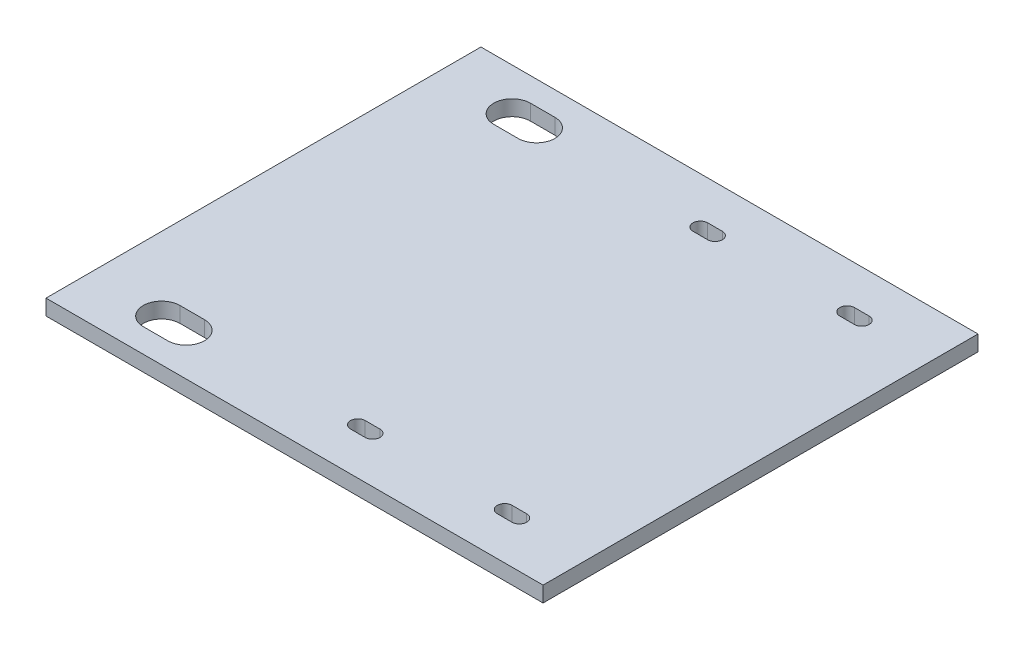
ISO-10303-21;
HEADER;
FILE_DESCRIPTION(('STEP AP214'),'2;1');
FILE_NAME('part.step','',(''),(''),'','','');
FILE_SCHEMA(('AUTOMOTIVE_DESIGN { 1 0 10303 214 1 1 1 1 }'));
ENDSEC;
DATA;
#1=APPLICATION_CONTEXT('core data for automotive mechanical design processes');
#2=APPLICATION_PROTOCOL_DEFINITION('international standard','automotive_design',2000,#1);
#3=PRODUCT_CONTEXT('',#1,'mechanical');
#4=PRODUCT('Part','Part','',(#3));
#5=PRODUCT_RELATED_PRODUCT_CATEGORY('part','',(#4));
#6=PRODUCT_DEFINITION_FORMATION('','',#4);
#7=PRODUCT_DEFINITION_CONTEXT('part definition',#1,'design');
#8=PRODUCT_DEFINITION('design','',#6,#7);
#9=PRODUCT_DEFINITION_SHAPE('','',#8);
#10=(LENGTH_UNIT() NAMED_UNIT(*) SI_UNIT(.MILLI.,.METRE.));
#11=(NAMED_UNIT(*) PLANE_ANGLE_UNIT() SI_UNIT($,.RADIAN.));
#12=(NAMED_UNIT(*) SI_UNIT($,.STERADIAN.) SOLID_ANGLE_UNIT());
#13=UNCERTAINTY_MEASURE_WITH_UNIT(LENGTH_MEASURE(1.E-05),#10,'distance_accuracy_value','');
#14=(GEOMETRIC_REPRESENTATION_CONTEXT(3) GLOBAL_UNCERTAINTY_ASSIGNED_CONTEXT((#13)) GLOBAL_UNIT_ASSIGNED_CONTEXT((#10,
#11,#12)) REPRESENTATION_CONTEXT('',''));
#15=CARTESIAN_POINT('',(0.,0.,0.));
#16=DIRECTION('',(0.,0.,1.));
#17=DIRECTION('',(1.,0.,0.));
#18=AXIS2_PLACEMENT_3D('',#15,#16,#17);
#19=CARTESIAN_POINT('',(-50.8,3.175,44.45));
#20=DIRECTION('',(1.,0.,0.));
#21=DIRECTION('',(0.,0.,-1.));
#22=AXIS2_PLACEMENT_3D('',#19,#20,#21);
#23=PLANE('',#22);
#24=DIRECTION('',(0.,0.,1.));
#25=VECTOR('',#24,1.);
#26=CARTESIAN_POINT('',(-50.8,0.,44.45));
#27=LINE('',#26,#25);
#28=CARTESIAN_POINT('',(-50.8,0.,-44.45));
#29=VERTEX_POINT('',#28);
#30=CARTESIAN_POINT('',(-50.8,0.,44.45));
#31=VERTEX_POINT('',#30);
#32=EDGE_CURVE('E484',#29,#31,#27,.T.);
#33=ORIENTED_EDGE('',*,*,#32,.T.);
#34=DIRECTION('',(0.,-1.,0.));
#35=VECTOR('',#34,1.);
#36=CARTESIAN_POINT('',(-50.8,3.175,44.45));
#37=LINE('',#36,#35);
#38=CARTESIAN_POINT('',(-50.8,3.175,44.45));
#39=VERTEX_POINT('',#38);
#40=EDGE_CURVE('E11',#39,#31,#37,.T.);
#41=ORIENTED_EDGE('',*,*,#40,.F.);
#42=DIRECTION('',(0.,0.,1.));
#43=VECTOR('',#42,1.);
#44=CARTESIAN_POINT('',(-50.8,3.175,44.45));
#45=LINE('',#44,#43);
#46=CARTESIAN_POINT('',(-50.8,3.175,-44.45));
#47=VERTEX_POINT('',#46);
#48=EDGE_CURVE('E494',#47,#39,#45,.T.);
#49=ORIENTED_EDGE('',*,*,#48,.F.);
#50=DIRECTION('',(0.,-1.,0.));
#51=VECTOR('',#50,1.);
#52=CARTESIAN_POINT('',(-50.8,3.175,-44.45));
#53=LINE('',#52,#51);
#54=EDGE_CURVE('E508',#47,#29,#53,.T.);
#55=ORIENTED_EDGE('',*,*,#54,.T.);
#56=EDGE_LOOP('',(#33,#41,#49,#55));
#57=FACE_BOUND('',#56,.T.);
#58=ADVANCED_FACE('F45',(#57),#23,.F.);
#59=CARTESIAN_POINT('',(50.8,3.175,44.45));
#60=DIRECTION('',(0.,0.,-1.));
#61=DIRECTION('',(-1.,0.,0.));
#62=AXIS2_PLACEMENT_3D('',#59,#60,#61);
#63=PLANE('',#62);
#64=DIRECTION('',(1.,0.,0.));
#65=VECTOR('',#64,1.);
#66=CARTESIAN_POINT('',(50.8,0.,44.45));
#67=LINE('',#66,#65);
#68=CARTESIAN_POINT('',(50.8,0.,44.45));
#69=VERTEX_POINT('',#68);
#70=EDGE_CURVE('E512',#31,#69,#67,.T.);
#71=ORIENTED_EDGE('',*,*,#70,.T.);
#72=DIRECTION('',(0.,-1.,0.));
#73=VECTOR('',#72,1.);
#74=CARTESIAN_POINT('',(50.8,3.175,44.45));
#75=LINE('',#74,#73);
#76=CARTESIAN_POINT('',(50.8,3.175,44.45));
#77=VERTEX_POINT('',#76);
#78=EDGE_CURVE('E53',#77,#69,#75,.T.);
#79=ORIENTED_EDGE('',*,*,#78,.F.);
#80=DIRECTION('',(1.,0.,0.));
#81=VECTOR('',#80,1.);
#82=CARTESIAN_POINT('',(50.8,3.175,44.45));
#83=LINE('',#82,#81);
#84=EDGE_CURVE('E498',#39,#77,#83,.T.);
#85=ORIENTED_EDGE('',*,*,#84,.F.);
#86=ORIENTED_EDGE('',*,*,#40,.T.);
#87=EDGE_LOOP('',(#71,#79,#85,#86));
#88=FACE_BOUND('',#87,.T.);
#89=ADVANCED_FACE('F547',(#88),#63,.F.);
#90=CARTESIAN_POINT('',(50.8,3.175,44.45));
#91=DIRECTION('',(-1.,0.,0.));
#92=DIRECTION('',(0.,0.,1.));
#93=AXIS2_PLACEMENT_3D('',#90,#91,#92);
#94=PLANE('',#93);
#95=DIRECTION('',(0.,0.,-1.));
#96=VECTOR('',#95,1.);
#97=CARTESIAN_POINT('',(50.8,0.,44.45));
#98=LINE('',#97,#96);
#99=CARTESIAN_POINT('',(50.8,0.,-44.45));
#100=VERTEX_POINT('',#99);
#101=EDGE_CURVE('E515',#69,#100,#98,.T.);
#102=ORIENTED_EDGE('',*,*,#101,.T.);
#103=DIRECTION('',(0.,-1.,0.));
#104=VECTOR('',#103,1.);
#105=CARTESIAN_POINT('',(50.8,3.175,-44.45));
#106=LINE('',#105,#104);
#107=CARTESIAN_POINT('',(50.8,3.175,-44.45));
#108=VERTEX_POINT('',#107);
#109=EDGE_CURVE('E523',#108,#100,#106,.T.);
#110=ORIENTED_EDGE('',*,*,#109,.F.);
#111=DIRECTION('',(0.,0.,-1.));
#112=VECTOR('',#111,1.);
#113=CARTESIAN_POINT('',(50.8,3.175,44.45));
#114=LINE('',#113,#112);
#115=EDGE_CURVE('E502',#77,#108,#114,.T.);
#116=ORIENTED_EDGE('',*,*,#115,.F.);
#117=ORIENTED_EDGE('',*,*,#78,.T.);
#118=EDGE_LOOP('',(#102,#110,#116,#117));
#119=FACE_BOUND('',#118,.T.);
#120=ADVANCED_FACE('F532',(#119),#94,.F.);
#121=CARTESIAN_POINT('',(50.8,3.175,-44.45));
#122=DIRECTION('',(0.,0.,1.));
#123=DIRECTION('',(1.,0.,0.));
#124=AXIS2_PLACEMENT_3D('',#121,#122,#123);
#125=PLANE('',#124);
#126=DIRECTION('',(-1.,0.,0.));
#127=VECTOR('',#126,1.);
#128=CARTESIAN_POINT('',(50.8,0.,-44.45));
#129=LINE('',#128,#127);
#130=EDGE_CURVE('E499',#100,#29,#129,.T.);
#131=ORIENTED_EDGE('',*,*,#130,.T.);
#132=ORIENTED_EDGE('',*,*,#54,.F.);
#133=DIRECTION('',(-1.,0.,0.));
#134=VECTOR('',#133,1.);
#135=CARTESIAN_POINT('',(50.8,3.175,-44.45));
#136=LINE('',#135,#134);
#137=EDGE_CURVE('E505',#108,#47,#136,.T.);
#138=ORIENTED_EDGE('',*,*,#137,.F.);
#139=ORIENTED_EDGE('',*,*,#109,.T.);
#140=EDGE_LOOP('',(#131,#132,#138,#139));
#141=FACE_BOUND('',#140,.T.);
#142=ADVANCED_FACE('F541',(#141),#125,.F.);
#143=CARTESIAN_POINT('',(0.,3.175,0.));
#144=DIRECTION('',(0.,1.,0.));
#145=DIRECTION('',(0.,0.,1.));
#146=AXIS2_PLACEMENT_3D('',#143,#144,#145);
#147=PLANE('',#146);
#148=CARTESIAN_POINT('',(3.5,3.175,35.));
#149=DIRECTION('',(0.,1.,0.));
#150=DIRECTION('',(0.,0.,1.));
#151=AXIS2_PLACEMENT_3D('',#148,#149,#150);
#152=CIRCLE('',#151,1.5);
#153=CARTESIAN_POINT('',(3.5,3.175,33.5));
#154=VERTEX_POINT('',#153);
#155=CARTESIAN_POINT('',(3.5,3.175,36.5));
#156=VERTEX_POINT('',#155);
#157=EDGE_CURVE('E60',#154,#156,#152,.T.);
#158=ORIENTED_EDGE('',*,*,#157,.F.);
#159=DIRECTION('',(-1.,0.,0.));
#160=VECTOR('',#159,1.);
#161=CARTESIAN_POINT('',(3.5,3.175,33.5));
#162=LINE('',#161,#160);
#163=CARTESIAN_POINT('',(6.5,3.175,33.5));
#164=VERTEX_POINT('',#163);
#165=EDGE_CURVE('E333',#164,#154,#162,.T.);
#166=ORIENTED_EDGE('',*,*,#165,.F.);
#167=CARTESIAN_POINT('',(6.5,3.175,35.));
#168=DIRECTION('',(0.,1.,0.));
#169=DIRECTION('',(0.,0.,1.));
#170=AXIS2_PLACEMENT_3D('',#167,#168,#169);
#171=CIRCLE('',#170,1.5);
#172=CARTESIAN_POINT('',(6.5,3.175,36.5));
#173=VERTEX_POINT('',#172);
#174=EDGE_CURVE('E337',#173,#164,#171,.T.);
#175=ORIENTED_EDGE('',*,*,#174,.F.);
#176=DIRECTION('',(1.,0.,0.));
#177=VECTOR('',#176,1.);
#178=CARTESIAN_POINT('',(3.5,3.175,36.5));
#179=LINE('',#178,#177);
#180=EDGE_CURVE('E342',#156,#173,#179,.T.);
#181=ORIENTED_EDGE('',*,*,#180,.F.);
#182=EDGE_LOOP('',(#158,#166,#175,#181));
#183=FACE_BOUND('',#182,.T.);
#184=CARTESIAN_POINT('',(33.5,3.175,-35.));
#185=DIRECTION('',(0.,1.,0.));
#186=DIRECTION('',(0.,0.,1.));
#187=AXIS2_PLACEMENT_3D('',#184,#185,#186);
#188=CIRCLE('',#187,1.49999999999999);
#189=CARTESIAN_POINT('',(33.5,3.175,-36.5));
#190=VERTEX_POINT('',#189);
#191=CARTESIAN_POINT('',(33.5,3.175,-33.5));
#192=VERTEX_POINT('',#191);
#193=EDGE_CURVE('E68',#190,#192,#188,.T.);
#194=ORIENTED_EDGE('',*,*,#193,.F.);
#195=DIRECTION('',(-1.,0.,0.));
#196=VECTOR('',#195,1.);
#197=CARTESIAN_POINT('',(33.5,3.175,-36.5));
#198=LINE('',#197,#196);
#199=CARTESIAN_POINT('',(36.5,3.175,-36.5));
#200=VERTEX_POINT('',#199);
#201=EDGE_CURVE('E294',#200,#190,#198,.T.);
#202=ORIENTED_EDGE('',*,*,#201,.F.);
#203=CARTESIAN_POINT('',(36.5,3.175,-35.));
#204=DIRECTION('',(0.,1.,0.));
#205=DIRECTION('',(0.,0.,1.));
#206=AXIS2_PLACEMENT_3D('',#203,#204,#205);
#207=CIRCLE('',#206,1.49999999999999);
#208=CARTESIAN_POINT('',(36.5,3.175,-33.5));
#209=VERTEX_POINT('',#208);
#210=EDGE_CURVE('E298',#209,#200,#207,.T.);
#211=ORIENTED_EDGE('',*,*,#210,.F.);
#212=DIRECTION('',(1.,0.,0.));
#213=VECTOR('',#212,1.);
#214=CARTESIAN_POINT('',(33.5,3.175,-33.5));
#215=LINE('',#214,#213);
#216=EDGE_CURVE('E303',#192,#209,#215,.T.);
#217=ORIENTED_EDGE('',*,*,#216,.F.);
#218=EDGE_LOOP('',(#194,#202,#211,#217));
#219=FACE_BOUND('',#218,.T.);
#220=CARTESIAN_POINT('',(3.49999999999999,3.175,-35.));
#221=DIRECTION('',(0.,1.,0.));
#222=DIRECTION('',(0.,0.,1.));
#223=AXIS2_PLACEMENT_3D('',#220,#221,#222);
#224=CIRCLE('',#223,1.49999999999999);
#225=CARTESIAN_POINT('',(3.49999999999999,3.175,-36.5));
#226=VERTEX_POINT('',#225);
#227=CARTESIAN_POINT('',(3.49999999999999,3.175,-33.5));
#228=VERTEX_POINT('',#227);
#229=EDGE_CURVE('E376',#226,#228,#224,.T.);
#230=ORIENTED_EDGE('',*,*,#229,.F.);
#231=DIRECTION('',(-1.,0.,0.));
#232=VECTOR('',#231,1.);
#233=CARTESIAN_POINT('',(3.49999999999999,3.175,-36.5));
#234=LINE('',#233,#232);
#235=CARTESIAN_POINT('',(6.49999999999998,3.175,-36.5));
#236=VERTEX_POINT('',#235);
#237=EDGE_CURVE('E421',#236,#226,#234,.T.);
#238=ORIENTED_EDGE('',*,*,#237,.F.);
#239=CARTESIAN_POINT('',(6.49999999999998,3.175,-35.));
#240=DIRECTION('',(0.,1.,0.));
#241=DIRECTION('',(0.,0.,1.));
#242=AXIS2_PLACEMENT_3D('',#239,#240,#241);
#243=CIRCLE('',#242,1.49999999999999);
#244=CARTESIAN_POINT('',(6.49999999999998,3.175,-33.5));
#245=VERTEX_POINT('',#244);
#246=EDGE_CURVE('E425',#245,#236,#243,.T.);
#247=ORIENTED_EDGE('',*,*,#246,.F.);
#248=DIRECTION('',(1.,0.,0.));
#249=VECTOR('',#248,1.);
#250=CARTESIAN_POINT('',(3.49999999999999,3.175,-33.5));
#251=LINE('',#250,#249);
#252=EDGE_CURVE('E430',#228,#245,#251,.T.);
#253=ORIENTED_EDGE('',*,*,#252,.F.);
#254=EDGE_LOOP('',(#230,#238,#247,#253));
#255=FACE_BOUND('',#254,.T.);
#256=CARTESIAN_POINT('',(-35.8,3.175,35.814));
#257=DIRECTION('',(0.,1.,0.));
#258=DIRECTION('',(0.,0.,1.));
#259=AXIS2_PLACEMENT_3D('',#256,#257,#258);
#260=CIRCLE('',#259,3.75);
#261=CARTESIAN_POINT('',(-35.8,3.175,32.064));
#262=VERTEX_POINT('',#261);
#263=CARTESIAN_POINT('',(-35.8,3.175,39.564));
#264=VERTEX_POINT('',#263);
#265=EDGE_CURVE('E390',#262,#264,#260,.T.);
#266=ORIENTED_EDGE('',*,*,#265,.F.);
#267=DIRECTION('',(-1.,0.,0.));
#268=VECTOR('',#267,1.);
#269=CARTESIAN_POINT('',(-35.8,3.175,32.064));
#270=LINE('',#269,#268);
#271=CARTESIAN_POINT('',(-30.8,3.175,32.064));
#272=VERTEX_POINT('',#271);
#273=EDGE_CURVE('E377',#272,#262,#270,.T.);
#274=ORIENTED_EDGE('',*,*,#273,.F.);
#275=CARTESIAN_POINT('',(-30.8,3.175,35.814));
#276=DIRECTION('',(0.,1.,0.));
#277=DIRECTION('',(0.,0.,1.));
#278=AXIS2_PLACEMENT_3D('',#275,#276,#277);
#279=CIRCLE('',#278,3.75);
#280=CARTESIAN_POINT('',(-30.8,3.175,39.564));
#281=VERTEX_POINT('',#280);
#282=EDGE_CURVE('E381',#281,#272,#279,.T.);
#283=ORIENTED_EDGE('',*,*,#282,.F.);
#284=DIRECTION('',(1.,0.,0.));
#285=VECTOR('',#284,1.);
#286=CARTESIAN_POINT('',(-35.8,3.175,39.564));
#287=LINE('',#286,#285);
#288=EDGE_CURVE('E386',#264,#281,#287,.T.);
#289=ORIENTED_EDGE('',*,*,#288,.F.);
#290=EDGE_LOOP('',(#266,#274,#283,#289));
#291=FACE_BOUND('',#290,.T.);
#292=CARTESIAN_POINT('',(33.5,3.175,35.));
#293=DIRECTION('',(0.,1.,0.));
#294=DIRECTION('',(0.,0.,1.));
#295=AXIS2_PLACEMENT_3D('',#292,#293,#294);
#296=CIRCLE('',#295,1.5);
#297=CARTESIAN_POINT('',(33.5,3.175,33.5));
#298=VERTEX_POINT('',#297);
#299=CARTESIAN_POINT('',(33.5,3.175,36.5));
#300=VERTEX_POINT('',#299);
#301=EDGE_CURVE('E233',#298,#300,#296,.T.);
#302=ORIENTED_EDGE('',*,*,#301,.F.);
#303=DIRECTION('',(-1.,0.,0.));
#304=VECTOR('',#303,1.);
#305=CARTESIAN_POINT('',(33.5,3.175,33.5));
#306=LINE('',#305,#304);
#307=CARTESIAN_POINT('',(36.5,3.175,33.5));
#308=VERTEX_POINT('',#307);
#309=EDGE_CURVE('E244',#308,#298,#306,.T.);
#310=ORIENTED_EDGE('',*,*,#309,.F.);
#311=CARTESIAN_POINT('',(36.5,3.175,35.));
#312=DIRECTION('',(0.,1.,0.));
#313=DIRECTION('',(0.,0.,1.));
#314=AXIS2_PLACEMENT_3D('',#311,#312,#313);
#315=CIRCLE('',#314,1.5);
#316=CARTESIAN_POINT('',(36.5,3.175,36.5));
#317=VERTEX_POINT('',#316);
#318=EDGE_CURVE('E250',#317,#308,#315,.T.);
#319=ORIENTED_EDGE('',*,*,#318,.F.);
#320=DIRECTION('',(1.,0.,0.));
#321=VECTOR('',#320,1.);
#322=CARTESIAN_POINT('',(33.5,3.175,36.5));
#323=LINE('',#322,#321);
#324=EDGE_CURVE('E256',#300,#317,#323,.T.);
#325=ORIENTED_EDGE('',*,*,#324,.F.);
#326=EDGE_LOOP('',(#302,#310,#319,#325));
#327=FACE_BOUND('',#326,.T.);
#328=CARTESIAN_POINT('',(-35.8,3.175,-35.814));
#329=DIRECTION('',(0.,1.,0.));
#330=DIRECTION('',(0.,0.,1.));
#331=AXIS2_PLACEMENT_3D('',#328,#329,#330);
#332=CIRCLE('',#331,3.75);
#333=CARTESIAN_POINT('',(-35.8,3.175,-39.564));
#334=VERTEX_POINT('',#333);
#335=CARTESIAN_POINT('',(-35.8,3.175,-32.064));
#336=VERTEX_POINT('',#335);
#337=EDGE_CURVE('E393',#334,#336,#332,.T.);
#338=ORIENTED_EDGE('',*,*,#337,.F.);
#339=DIRECTION('',(-1.,0.,0.));
#340=VECTOR('',#339,1.);
#341=CARTESIAN_POINT('',(-35.8,3.175,-39.564));
#342=LINE('',#341,#340);
#343=CARTESIAN_POINT('',(-30.8,3.175,-39.564));
#344=VERTEX_POINT('',#343);
#345=EDGE_CURVE('E455',#344,#334,#342,.T.);
#346=ORIENTED_EDGE('',*,*,#345,.F.);
#347=CARTESIAN_POINT('',(-30.8,3.175,-35.814));
#348=DIRECTION('',(0.,1.,0.));
#349=DIRECTION('',(0.,0.,1.));
#350=AXIS2_PLACEMENT_3D('',#347,#348,#349);
#351=CIRCLE('',#350,3.75);
#352=CARTESIAN_POINT('',(-30.8,3.175,-32.064));
#353=VERTEX_POINT('',#352);
#354=EDGE_CURVE('E474',#353,#344,#351,.T.);
#355=ORIENTED_EDGE('',*,*,#354,.F.);
#356=DIRECTION('',(1.,0.,0.));
#357=VECTOR('',#356,1.);
#358=CARTESIAN_POINT('',(-35.8,3.175,-32.064));
#359=LINE('',#358,#357);
#360=EDGE_CURVE('E470',#336,#353,#359,.T.);
#361=ORIENTED_EDGE('',*,*,#360,.F.);
#362=EDGE_LOOP('',(#338,#346,#355,#361));
#363=FACE_BOUND('',#362,.T.);
#364=ORIENTED_EDGE('',*,*,#48,.T.);
#365=ORIENTED_EDGE('',*,*,#84,.T.);
#366=ORIENTED_EDGE('',*,*,#115,.T.);
#367=ORIENTED_EDGE('',*,*,#137,.T.);
#368=EDGE_LOOP('',(#364,#365,#366,#367));
#369=FACE_BOUND('',#368,.T.);
#370=ADVANCED_FACE('F253',(#183,#219,#255,#291,#327,#363,#369),#147,.T.);
#371=CARTESIAN_POINT('',(0.,0.,0.));
#372=DIRECTION('',(0.,1.,0.));
#373=DIRECTION('',(0.,0.,1.));
#374=AXIS2_PLACEMENT_3D('',#371,#372,#373);
#375=PLANE('',#374);
#376=DIRECTION('',(-1.,0.,0.));
#377=VECTOR('',#376,1.);
#378=CARTESIAN_POINT('',(3.5,0.,33.5));
#379=LINE('',#378,#377);
#380=CARTESIAN_POINT('',(6.5,0.,33.5));
#381=VERTEX_POINT('',#380);
#382=CARTESIAN_POINT('',(3.5,0.,33.5));
#383=VERTEX_POINT('',#382);
#384=EDGE_CURVE('E327',#381,#383,#379,.T.);
#385=ORIENTED_EDGE('',*,*,#384,.T.);
#386=CARTESIAN_POINT('',(3.5,0.,35.));
#387=DIRECTION('',(0.,1.,0.));
#388=DIRECTION('',(0.,0.,1.));
#389=AXIS2_PLACEMENT_3D('',#386,#387,#388);
#390=CIRCLE('',#389,1.5);
#391=CARTESIAN_POINT('',(3.5,0.,36.5));
#392=VERTEX_POINT('',#391);
#393=EDGE_CURVE('E338',#383,#392,#390,.T.);
#394=ORIENTED_EDGE('',*,*,#393,.T.);
#395=DIRECTION('',(1.,0.,0.));
#396=VECTOR('',#395,1.);
#397=CARTESIAN_POINT('',(3.5,0.,36.5));
#398=LINE('',#397,#396);
#399=CARTESIAN_POINT('',(6.5,0.,36.5));
#400=VERTEX_POINT('',#399);
#401=EDGE_CURVE('E355',#392,#400,#398,.T.);
#402=ORIENTED_EDGE('',*,*,#401,.T.);
#403=CARTESIAN_POINT('',(6.5,0.,35.));
#404=DIRECTION('',(0.,1.,0.));
#405=DIRECTION('',(0.,0.,1.));
#406=AXIS2_PLACEMENT_3D('',#403,#404,#405);
#407=CIRCLE('',#406,1.5);
#408=EDGE_CURVE('E351',#400,#381,#407,.T.);
#409=ORIENTED_EDGE('',*,*,#408,.T.);
#410=EDGE_LOOP('',(#385,#394,#402,#409));
#411=FACE_BOUND('',#410,.T.);
#412=DIRECTION('',(-1.,0.,0.));
#413=VECTOR('',#412,1.);
#414=CARTESIAN_POINT('',(33.5,0.,-36.5));
#415=LINE('',#414,#413);
#416=CARTESIAN_POINT('',(36.5,0.,-36.5));
#417=VERTEX_POINT('',#416);
#418=CARTESIAN_POINT('',(33.5,0.,-36.5));
#419=VERTEX_POINT('',#418);
#420=EDGE_CURVE('E284',#417,#419,#415,.T.);
#421=ORIENTED_EDGE('',*,*,#420,.T.);
#422=CARTESIAN_POINT('',(33.5,0.,-35.));
#423=DIRECTION('',(0.,1.,0.));
#424=DIRECTION('',(0.,0.,1.));
#425=AXIS2_PLACEMENT_3D('',#422,#423,#424);
#426=CIRCLE('',#425,1.49999999999999);
#427=CARTESIAN_POINT('',(33.5,0.,-33.5));
#428=VERTEX_POINT('',#427);
#429=EDGE_CURVE('E299',#419,#428,#426,.T.);
#430=ORIENTED_EDGE('',*,*,#429,.T.);
#431=DIRECTION('',(1.,0.,0.));
#432=VECTOR('',#431,1.);
#433=CARTESIAN_POINT('',(33.5,0.,-33.5));
#434=LINE('',#433,#432);
#435=CARTESIAN_POINT('',(36.5,0.,-33.5));
#436=VERTEX_POINT('',#435);
#437=EDGE_CURVE('E317',#428,#436,#434,.T.);
#438=ORIENTED_EDGE('',*,*,#437,.T.);
#439=CARTESIAN_POINT('',(36.5,0.,-35.));
#440=DIRECTION('',(0.,1.,0.));
#441=DIRECTION('',(0.,0.,1.));
#442=AXIS2_PLACEMENT_3D('',#439,#440,#441);
#443=CIRCLE('',#442,1.49999999999999);
#444=EDGE_CURVE('E313',#436,#417,#443,.T.);
#445=ORIENTED_EDGE('',*,*,#444,.T.);
#446=EDGE_LOOP('',(#421,#430,#438,#445));
#447=FACE_BOUND('',#446,.T.);
#448=DIRECTION('',(-1.,0.,0.));
#449=VECTOR('',#448,1.);
#450=CARTESIAN_POINT('',(3.49999999999999,0.,-36.5));
#451=LINE('',#450,#449);
#452=CARTESIAN_POINT('',(6.49999999999998,0.,-36.5));
#453=VERTEX_POINT('',#452);
#454=CARTESIAN_POINT('',(3.49999999999999,0.,-36.5));
#455=VERTEX_POINT('',#454);
#456=EDGE_CURVE('E412',#453,#455,#451,.T.);
#457=ORIENTED_EDGE('',*,*,#456,.T.);
#458=CARTESIAN_POINT('',(3.49999999999999,0.,-35.));
#459=DIRECTION('',(0.,1.,0.));
#460=DIRECTION('',(0.,0.,1.));
#461=AXIS2_PLACEMENT_3D('',#458,#459,#460);
#462=CIRCLE('',#461,1.49999999999999);
#463=CARTESIAN_POINT('',(3.49999999999999,0.,-33.5));
#464=VERTEX_POINT('',#463);
#465=EDGE_CURVE('E426',#455,#464,#462,.T.);
#466=ORIENTED_EDGE('',*,*,#465,.T.);
#467=DIRECTION('',(1.,0.,0.));
#468=VECTOR('',#467,1.);
#469=CARTESIAN_POINT('',(3.49999999999999,0.,-33.5));
#470=LINE('',#469,#468);
#471=CARTESIAN_POINT('',(6.49999999999998,0.,-33.5));
#472=VERTEX_POINT('',#471);
#473=EDGE_CURVE('E443',#464,#472,#470,.T.);
#474=ORIENTED_EDGE('',*,*,#473,.T.);
#475=CARTESIAN_POINT('',(6.49999999999998,0.,-35.));
#476=DIRECTION('',(0.,1.,0.));
#477=DIRECTION('',(0.,0.,1.));
#478=AXIS2_PLACEMENT_3D('',#475,#476,#477);
#479=CIRCLE('',#478,1.49999999999999);
#480=EDGE_CURVE('E439',#472,#453,#479,.T.);
#481=ORIENTED_EDGE('',*,*,#480,.T.);
#482=EDGE_LOOP('',(#457,#466,#474,#481));
#483=FACE_BOUND('',#482,.T.);
#484=DIRECTION('',(-1.,0.,0.));
#485=VECTOR('',#484,1.);
#486=CARTESIAN_POINT('',(-35.8,0.,32.064));
#487=LINE('',#486,#485);
#488=CARTESIAN_POINT('',(-30.8,0.,32.064));
#489=VERTEX_POINT('',#488);
#490=CARTESIAN_POINT('',(-35.8,0.,32.064));
#491=VERTEX_POINT('',#490);
#492=EDGE_CURVE('E366',#489,#491,#487,.T.);
#493=ORIENTED_EDGE('',*,*,#492,.T.);
#494=CARTESIAN_POINT('',(-35.8,0.,35.814));
#495=DIRECTION('',(0.,1.,0.));
#496=DIRECTION('',(0.,0.,1.));
#497=AXIS2_PLACEMENT_3D('',#494,#495,#496);
#498=CIRCLE('',#497,3.75);
#499=CARTESIAN_POINT('',(-35.8,0.,39.564));
#500=VERTEX_POINT('',#499);
#501=EDGE_CURVE('E382',#491,#500,#498,.T.);
#502=ORIENTED_EDGE('',*,*,#501,.T.);
#503=DIRECTION('',(1.,0.,0.));
#504=VECTOR('',#503,1.);
#505=CARTESIAN_POINT('',(-35.8,0.,39.564));
#506=LINE('',#505,#504);
#507=CARTESIAN_POINT('',(-30.8,0.,39.564));
#508=VERTEX_POINT('',#507);
#509=EDGE_CURVE('E401',#500,#508,#506,.T.);
#510=ORIENTED_EDGE('',*,*,#509,.T.);
#511=CARTESIAN_POINT('',(-30.8,0.,35.814));
#512=DIRECTION('',(0.,1.,0.));
#513=DIRECTION('',(0.,0.,1.));
#514=AXIS2_PLACEMENT_3D('',#511,#512,#513);
#515=CIRCLE('',#514,3.75);
#516=EDGE_CURVE('E397',#508,#489,#515,.T.);
#517=ORIENTED_EDGE('',*,*,#516,.T.);
#518=EDGE_LOOP('',(#493,#502,#510,#517));
#519=FACE_BOUND('',#518,.T.);
#520=DIRECTION('',(-1.,0.,0.));
#521=VECTOR('',#520,1.);
#522=CARTESIAN_POINT('',(33.5,0.,33.5));
#523=LINE('',#522,#521);
#524=CARTESIAN_POINT('',(36.5,0.,33.5));
#525=VERTEX_POINT('',#524);
#526=CARTESIAN_POINT('',(33.5,0.,33.5));
#527=VERTEX_POINT('',#526);
#528=EDGE_CURVE('E267',#525,#527,#523,.T.);
#529=ORIENTED_EDGE('',*,*,#528,.T.);
#530=CARTESIAN_POINT('',(33.5,0.,35.));
#531=DIRECTION('',(0.,1.,0.));
#532=DIRECTION('',(0.,0.,1.));
#533=AXIS2_PLACEMENT_3D('',#530,#531,#532);
#534=CIRCLE('',#533,1.5);
#535=CARTESIAN_POINT('',(33.5,0.,36.5));
#536=VERTEX_POINT('',#535);
#537=EDGE_CURVE('E236',#527,#536,#534,.T.);
#538=ORIENTED_EDGE('',*,*,#537,.T.);
#539=DIRECTION('',(1.,0.,0.));
#540=VECTOR('',#539,1.);
#541=CARTESIAN_POINT('',(33.5,0.,36.5));
#542=LINE('',#541,#540);
#543=CARTESIAN_POINT('',(36.5,0.,36.5));
#544=VERTEX_POINT('',#543);
#545=EDGE_CURVE('E275',#536,#544,#542,.T.);
#546=ORIENTED_EDGE('',*,*,#545,.T.);
#547=CARTESIAN_POINT('',(36.5,0.,35.));
#548=DIRECTION('',(0.,1.,0.));
#549=DIRECTION('',(0.,0.,1.));
#550=AXIS2_PLACEMENT_3D('',#547,#548,#549);
#551=CIRCLE('',#550,1.5);
#552=EDGE_CURVE('E270',#544,#525,#551,.T.);
#553=ORIENTED_EDGE('',*,*,#552,.T.);
#554=EDGE_LOOP('',(#529,#538,#546,#553));
#555=FACE_BOUND('',#554,.T.);
#556=DIRECTION('',(-1.,0.,0.));
#557=VECTOR('',#556,1.);
#558=CARTESIAN_POINT('',(-35.8,0.,-39.564));
#559=LINE('',#558,#557);
#560=CARTESIAN_POINT('',(-30.8,0.,-39.564));
#561=VERTEX_POINT('',#560);
#562=CARTESIAN_POINT('',(-35.8,0.,-39.564));
#563=VERTEX_POINT('',#562);
#564=EDGE_CURVE('E463',#561,#563,#559,.T.);
#565=ORIENTED_EDGE('',*,*,#564,.T.);
#566=CARTESIAN_POINT('',(-35.8,0.,-35.814));
#567=DIRECTION('',(0.,1.,0.));
#568=DIRECTION('',(0.,0.,1.));
#569=AXIS2_PLACEMENT_3D('',#566,#567,#568);
#570=CIRCLE('',#569,3.75);
#571=CARTESIAN_POINT('',(-35.8,0.,-32.064));
#572=VERTEX_POINT('',#571);
#573=EDGE_CURVE('E450',#563,#572,#570,.T.);
#574=ORIENTED_EDGE('',*,*,#573,.T.);
#575=DIRECTION('',(1.,0.,0.));
#576=VECTOR('',#575,1.);
#577=CARTESIAN_POINT('',(-35.8,0.,-32.064));
#578=LINE('',#577,#576);
#579=CARTESIAN_POINT('',(-30.8,0.,-32.064));
#580=VERTEX_POINT('',#579);
#581=EDGE_CURVE('E454',#572,#580,#578,.T.);
#582=ORIENTED_EDGE('',*,*,#581,.T.);
#583=CARTESIAN_POINT('',(-30.8,0.,-35.814));
#584=DIRECTION('',(0.,1.,0.));
#585=DIRECTION('',(0.,0.,1.));
#586=AXIS2_PLACEMENT_3D('',#583,#584,#585);
#587=CIRCLE('',#586,3.75);
#588=EDGE_CURVE('E459',#580,#561,#587,.T.);
#589=ORIENTED_EDGE('',*,*,#588,.T.);
#590=EDGE_LOOP('',(#565,#574,#582,#589));
#591=FACE_BOUND('',#590,.T.);
#592=ORIENTED_EDGE('',*,*,#32,.F.);
#593=ORIENTED_EDGE('',*,*,#130,.F.);
#594=ORIENTED_EDGE('',*,*,#101,.F.);
#595=ORIENTED_EDGE('',*,*,#70,.F.);
#596=EDGE_LOOP('',(#592,#593,#594,#595));
#597=FACE_BOUND('',#596,.T.);
#598=ADVANCED_FACE('F538',(#411,#447,#483,#519,#555,#591,#597),#375,.F.);
#599=CARTESIAN_POINT('',(-35.8,0.,-35.814));
#600=DIRECTION('',(0.,1.,0.));
#601=DIRECTION('',(0.,0.,1.));
#602=AXIS2_PLACEMENT_3D('',#599,#600,#601);
#603=CYLINDRICAL_SURFACE('',#602,3.75);
#604=ORIENTED_EDGE('',*,*,#337,.T.);
#605=DIRECTION('',(0.,1.,0.));
#606=VECTOR('',#605,1.);
#607=CARTESIAN_POINT('',(-35.8,0.,-32.064));
#608=LINE('',#607,#606);
#609=EDGE_CURVE('E467',#572,#336,#608,.T.);
#610=ORIENTED_EDGE('',*,*,#609,.F.);
#611=ORIENTED_EDGE('',*,*,#573,.F.);
#612=DIRECTION('',(0.,1.,0.));
#613=VECTOR('',#612,1.);
#614=CARTESIAN_POINT('',(-35.8,0.,-39.564));
#615=LINE('',#614,#613);
#616=EDGE_CURVE('E481',#563,#334,#615,.T.);
#617=ORIENTED_EDGE('',*,*,#616,.T.);
#618=EDGE_LOOP('',(#604,#610,#611,#617));
#619=FACE_BOUND('',#618,.T.);
#620=ADVANCED_FACE('F559',(#619),#603,.F.);
#621=CARTESIAN_POINT('',(-35.8,0.,-39.564));
#622=DIRECTION('',(0.,0.,-1.));
#623=DIRECTION('',(-1.,0.,0.));
#624=AXIS2_PLACEMENT_3D('',#621,#622,#623);
#625=PLANE('',#624);
#626=ORIENTED_EDGE('',*,*,#345,.T.);
#627=ORIENTED_EDGE('',*,*,#616,.F.);
#628=ORIENTED_EDGE('',*,*,#564,.F.);
#629=DIRECTION('',(0.,1.,0.));
#630=VECTOR('',#629,1.);
#631=CARTESIAN_POINT('',(-30.8,0.,-39.564));
#632=LINE('',#631,#630);
#633=EDGE_CURVE('E485',#561,#344,#632,.T.);
#634=ORIENTED_EDGE('',*,*,#633,.T.);
#635=EDGE_LOOP('',(#626,#627,#628,#634));
#636=FACE_BOUND('',#635,.T.);
#637=ADVANCED_FACE('F566',(#636),#625,.F.);
#638=CARTESIAN_POINT('',(-30.8,0.,-35.814));
#639=DIRECTION('',(0.,1.,0.));
#640=DIRECTION('',(0.,0.,1.));
#641=AXIS2_PLACEMENT_3D('',#638,#639,#640);
#642=CYLINDRICAL_SURFACE('',#641,3.75);
#643=ORIENTED_EDGE('',*,*,#354,.T.);
#644=ORIENTED_EDGE('',*,*,#633,.F.);
#645=ORIENTED_EDGE('',*,*,#588,.F.);
#646=DIRECTION('',(0.,1.,0.));
#647=VECTOR('',#646,1.);
#648=CARTESIAN_POINT('',(-30.8,0.,-32.064));
#649=LINE('',#648,#647);
#650=EDGE_CURVE('E488',#580,#353,#649,.T.);
#651=ORIENTED_EDGE('',*,*,#650,.T.);
#652=EDGE_LOOP('',(#643,#644,#645,#651));
#653=FACE_BOUND('',#652,.T.);
#654=ADVANCED_FACE('F571',(#653),#642,.F.);
#655=CARTESIAN_POINT('',(-35.8,0.,-32.064));
#656=DIRECTION('',(0.,0.,1.));
#657=DIRECTION('',(1.,0.,0.));
#658=AXIS2_PLACEMENT_3D('',#655,#656,#657);
#659=PLANE('',#658);
#660=ORIENTED_EDGE('',*,*,#360,.T.);
#661=ORIENTED_EDGE('',*,*,#650,.F.);
#662=ORIENTED_EDGE('',*,*,#581,.F.);
#663=ORIENTED_EDGE('',*,*,#609,.T.);
#664=EDGE_LOOP('',(#660,#661,#662,#663));
#665=FACE_BOUND('',#664,.T.);
#666=ADVANCED_FACE('F568',(#665),#659,.F.);
#667=CARTESIAN_POINT('',(33.5,0.,35.));
#668=DIRECTION('',(0.,1.,0.));
#669=DIRECTION('',(0.,0.,1.));
#670=AXIS2_PLACEMENT_3D('',#667,#668,#669);
#671=CYLINDRICAL_SURFACE('',#670,1.5);
#672=ORIENTED_EDGE('',*,*,#301,.T.);
#673=DIRECTION('',(0.,1.,0.));
#674=VECTOR('',#673,1.);
#675=CARTESIAN_POINT('',(33.5,0.,36.5));
#676=LINE('',#675,#674);
#677=EDGE_CURVE('E271',#536,#300,#676,.T.);
#678=ORIENTED_EDGE('',*,*,#677,.F.);
#679=ORIENTED_EDGE('',*,*,#537,.F.);
#680=DIRECTION('',(0.,1.,0.));
#681=VECTOR('',#680,1.);
#682=CARTESIAN_POINT('',(33.5,0.,33.5));
#683=LINE('',#682,#681);
#684=EDGE_CURVE('E229',#527,#298,#683,.T.);
#685=ORIENTED_EDGE('',*,*,#684,.T.);
#686=EDGE_LOOP('',(#672,#678,#679,#685));
#687=FACE_BOUND('',#686,.T.);
#688=ADVANCED_FACE('F231',(#687),#671,.F.);
#689=CARTESIAN_POINT('',(33.5,0.,33.5));
#690=DIRECTION('',(0.,0.,-1.));
#691=DIRECTION('',(-1.,0.,0.));
#692=AXIS2_PLACEMENT_3D('',#689,#690,#691);
#693=PLANE('',#692);
#694=ORIENTED_EDGE('',*,*,#309,.T.);
#695=ORIENTED_EDGE('',*,*,#684,.F.);
#696=ORIENTED_EDGE('',*,*,#528,.F.);
#697=DIRECTION('',(0.,1.,0.));
#698=VECTOR('',#697,1.);
#699=CARTESIAN_POINT('',(36.5,0.,33.5));
#700=LINE('',#699,#698);
#701=EDGE_CURVE('E241',#525,#308,#700,.T.);
#702=ORIENTED_EDGE('',*,*,#701,.T.);
#703=EDGE_LOOP('',(#694,#695,#696,#702));
#704=FACE_BOUND('',#703,.T.);
#705=ADVANCED_FACE('F245',(#704),#693,.F.);
#706=CARTESIAN_POINT('',(36.5,0.,35.));
#707=DIRECTION('',(0.,1.,0.));
#708=DIRECTION('',(0.,0.,1.));
#709=AXIS2_PLACEMENT_3D('',#706,#707,#708);
#710=CYLINDRICAL_SURFACE('',#709,1.5);
#711=ORIENTED_EDGE('',*,*,#318,.T.);
#712=ORIENTED_EDGE('',*,*,#701,.F.);
#713=ORIENTED_EDGE('',*,*,#552,.F.);
#714=DIRECTION('',(0.,1.,0.));
#715=VECTOR('',#714,1.);
#716=CARTESIAN_POINT('',(36.5,0.,36.5));
#717=LINE('',#716,#715);
#718=EDGE_CURVE('E832',#544,#317,#717,.T.);
#719=ORIENTED_EDGE('',*,*,#718,.T.);
#720=EDGE_LOOP('',(#711,#712,#713,#719));
#721=FACE_BOUND('',#720,.T.);
#722=ADVANCED_FACE('F644',(#721),#710,.F.);
#723=CARTESIAN_POINT('',(33.5,0.,36.5));
#724=DIRECTION('',(0.,0.,1.));
#725=DIRECTION('',(1.,0.,0.));
#726=AXIS2_PLACEMENT_3D('',#723,#724,#725);
#727=PLANE('',#726);
#728=ORIENTED_EDGE('',*,*,#324,.T.);
#729=ORIENTED_EDGE('',*,*,#718,.F.);
#730=ORIENTED_EDGE('',*,*,#545,.F.);
#731=ORIENTED_EDGE('',*,*,#677,.T.);
#732=EDGE_LOOP('',(#728,#729,#730,#731));
#733=FACE_BOUND('',#732,.T.);
#734=ADVANCED_FACE('F611',(#733),#727,.F.);
#735=CARTESIAN_POINT('',(-35.8,0.,35.814));
#736=DIRECTION('',(0.,1.,0.));
#737=DIRECTION('',(0.,0.,1.));
#738=AXIS2_PLACEMENT_3D('',#735,#736,#737);
#739=CYLINDRICAL_SURFACE('',#738,3.75);
#740=ORIENTED_EDGE('',*,*,#265,.T.);
#741=DIRECTION('',(0.,1.,0.));
#742=VECTOR('',#741,1.);
#743=CARTESIAN_POINT('',(-35.8,0.,39.564));
#744=LINE('',#743,#742);
#745=EDGE_CURVE('E362',#500,#264,#744,.T.);
#746=ORIENTED_EDGE('',*,*,#745,.F.);
#747=ORIENTED_EDGE('',*,*,#501,.F.);
#748=DIRECTION('',(0.,1.,0.));
#749=VECTOR('',#748,1.);
#750=CARTESIAN_POINT('',(-35.8,0.,32.064));
#751=LINE('',#750,#749);
#752=EDGE_CURVE('E373',#491,#262,#751,.T.);
#753=ORIENTED_EDGE('',*,*,#752,.T.);
#754=EDGE_LOOP('',(#740,#746,#747,#753));
#755=FACE_BOUND('',#754,.T.);
#756=ADVANCED_FACE('F601',(#755),#739,.F.);
#757=CARTESIAN_POINT('',(-35.8,0.,32.064));
#758=DIRECTION('',(0.,0.,-1.));
#759=DIRECTION('',(-1.,0.,0.));
#760=AXIS2_PLACEMENT_3D('',#757,#758,#759);
#761=PLANE('',#760);
#762=ORIENTED_EDGE('',*,*,#273,.T.);
#763=ORIENTED_EDGE('',*,*,#752,.F.);
#764=ORIENTED_EDGE('',*,*,#492,.F.);
#765=DIRECTION('',(0.,1.,0.));
#766=VECTOR('',#765,1.);
#767=CARTESIAN_POINT('',(-30.8,0.,32.064));
#768=LINE('',#767,#766);
#769=EDGE_CURVE('E370',#489,#272,#768,.T.);
#770=ORIENTED_EDGE('',*,*,#769,.T.);
#771=EDGE_LOOP('',(#762,#763,#764,#770));
#772=FACE_BOUND('',#771,.T.);
#773=ADVANCED_FACE('F597',(#772),#761,.F.);
#774=CARTESIAN_POINT('',(-30.8,0.,35.814));
#775=DIRECTION('',(0.,1.,0.));
#776=DIRECTION('',(0.,0.,1.));
#777=AXIS2_PLACEMENT_3D('',#774,#775,#776);
#778=CYLINDRICAL_SURFACE('',#777,3.75);
#779=ORIENTED_EDGE('',*,*,#282,.T.);
#780=ORIENTED_EDGE('',*,*,#769,.F.);
#781=ORIENTED_EDGE('',*,*,#516,.F.);
#782=DIRECTION('',(0.,1.,0.));
#783=VECTOR('',#782,1.);
#784=CARTESIAN_POINT('',(-30.8,0.,39.564));
#785=LINE('',#784,#783);
#786=EDGE_CURVE('E367',#508,#281,#785,.T.);
#787=ORIENTED_EDGE('',*,*,#786,.T.);
#788=EDGE_LOOP('',(#779,#780,#781,#787));
#789=FACE_BOUND('',#788,.T.);
#790=ADVANCED_FACE('F600',(#789),#778,.F.);
#791=CARTESIAN_POINT('',(-35.8,0.,39.564));
#792=DIRECTION('',(0.,0.,1.));
#793=DIRECTION('',(1.,0.,0.));
#794=AXIS2_PLACEMENT_3D('',#791,#792,#793);
#795=PLANE('',#794);
#796=ORIENTED_EDGE('',*,*,#288,.T.);
#797=ORIENTED_EDGE('',*,*,#786,.F.);
#798=ORIENTED_EDGE('',*,*,#509,.F.);
#799=ORIENTED_EDGE('',*,*,#745,.T.);
#800=EDGE_LOOP('',(#796,#797,#798,#799));
#801=FACE_BOUND('',#800,.T.);
#802=ADVANCED_FACE('F595',(#801),#795,.F.);
#803=CARTESIAN_POINT('',(3.49999999999999,0.,-35.));
#804=DIRECTION('',(0.,1.,0.));
#805=DIRECTION('',(0.,0.,1.));
#806=AXIS2_PLACEMENT_3D('',#803,#804,#805);
#807=CYLINDRICAL_SURFACE('',#806,1.49999999999999);
#808=ORIENTED_EDGE('',*,*,#229,.T.);
#809=DIRECTION('',(0.,1.,0.));
#810=VECTOR('',#809,1.);
#811=CARTESIAN_POINT('',(3.49999999999999,0.,-33.5));
#812=LINE('',#811,#810);
#813=EDGE_CURVE('E408',#464,#228,#812,.T.);
#814=ORIENTED_EDGE('',*,*,#813,.F.);
#815=ORIENTED_EDGE('',*,*,#465,.F.);
#816=DIRECTION('',(0.,1.,0.));
#817=VECTOR('',#816,1.);
#818=CARTESIAN_POINT('',(3.49999999999999,0.,-36.5));
#819=LINE('',#818,#817);
#820=EDGE_CURVE('E309',#455,#226,#819,.T.);
#821=ORIENTED_EDGE('',*,*,#820,.T.);
#822=EDGE_LOOP('',(#808,#814,#815,#821));
#823=FACE_BOUND('',#822,.T.);
#824=ADVANCED_FACE('F583',(#823),#807,.F.);
#825=CARTESIAN_POINT('',(3.49999999999999,0.,-36.5));
#826=DIRECTION('',(0.,0.,-1.));
#827=DIRECTION('',(-1.,0.,0.));
#828=AXIS2_PLACEMENT_3D('',#825,#826,#827);
#829=PLANE('',#828);
#830=ORIENTED_EDGE('',*,*,#237,.T.);
#831=ORIENTED_EDGE('',*,*,#820,.F.);
#832=ORIENTED_EDGE('',*,*,#456,.F.);
#833=DIRECTION('',(0.,1.,0.));
#834=VECTOR('',#833,1.);
#835=CARTESIAN_POINT('',(6.49999999999998,0.,-36.5));
#836=LINE('',#835,#834);
#837=EDGE_CURVE('E416',#453,#236,#836,.T.);
#838=ORIENTED_EDGE('',*,*,#837,.T.);
#839=EDGE_LOOP('',(#830,#831,#832,#838));
#840=FACE_BOUND('',#839,.T.);
#841=ADVANCED_FACE('F579',(#840),#829,.F.);
#842=CARTESIAN_POINT('',(6.49999999999998,0.,-35.));
#843=DIRECTION('',(0.,1.,0.));
#844=DIRECTION('',(0.,0.,1.));
#845=AXIS2_PLACEMENT_3D('',#842,#843,#844);
#846=CYLINDRICAL_SURFACE('',#845,1.49999999999999);
#847=ORIENTED_EDGE('',*,*,#246,.T.);
#848=ORIENTED_EDGE('',*,*,#837,.F.);
#849=ORIENTED_EDGE('',*,*,#480,.F.);
#850=DIRECTION('',(0.,1.,0.));
#851=VECTOR('',#850,1.);
#852=CARTESIAN_POINT('',(6.49999999999998,0.,-33.5));
#853=LINE('',#852,#851);
#854=EDGE_CURVE('E413',#472,#245,#853,.T.);
#855=ORIENTED_EDGE('',*,*,#854,.T.);
#856=EDGE_LOOP('',(#847,#848,#849,#855));
#857=FACE_BOUND('',#856,.T.);
#858=ADVANCED_FACE('F582',(#857),#846,.F.);
#859=CARTESIAN_POINT('',(3.49999999999999,0.,-33.5));
#860=DIRECTION('',(0.,0.,1.));
#861=DIRECTION('',(1.,0.,0.));
#862=AXIS2_PLACEMENT_3D('',#859,#860,#861);
#863=PLANE('',#862);
#864=ORIENTED_EDGE('',*,*,#252,.T.);
#865=ORIENTED_EDGE('',*,*,#854,.F.);
#866=ORIENTED_EDGE('',*,*,#473,.F.);
#867=ORIENTED_EDGE('',*,*,#813,.T.);
#868=EDGE_LOOP('',(#864,#865,#866,#867));
#869=FACE_BOUND('',#868,.T.);
#870=ADVANCED_FACE('F587',(#869),#863,.F.);
#871=CARTESIAN_POINT('',(33.5,0.,-35.));
#872=DIRECTION('',(0.,1.,0.));
#873=DIRECTION('',(0.,0.,1.));
#874=AXIS2_PLACEMENT_3D('',#871,#872,#873);
#875=CYLINDRICAL_SURFACE('',#874,1.49999999999999);
#876=ORIENTED_EDGE('',*,*,#193,.T.);
#877=DIRECTION('',(0.,1.,0.));
#878=VECTOR('',#877,1.);
#879=CARTESIAN_POINT('',(33.5,0.,-33.5));
#880=LINE('',#879,#878);
#881=EDGE_CURVE('E281',#428,#192,#880,.T.);
#882=ORIENTED_EDGE('',*,*,#881,.F.);
#883=ORIENTED_EDGE('',*,*,#429,.F.);
#884=DIRECTION('',(0.,1.,0.));
#885=VECTOR('',#884,1.);
#886=CARTESIAN_POINT('',(33.5,0.,-36.5));
#887=LINE('',#886,#885);
#888=EDGE_CURVE('E291',#419,#190,#887,.T.);
#889=ORIENTED_EDGE('',*,*,#888,.T.);
#890=EDGE_LOOP('',(#876,#882,#883,#889));
#891=FACE_BOUND('',#890,.T.);
#892=ADVANCED_FACE('F591',(#891),#875,.F.);
#893=CARTESIAN_POINT('',(33.5,0.,-36.5));
#894=DIRECTION('',(0.,0.,-1.));
#895=DIRECTION('',(-1.,0.,0.));
#896=AXIS2_PLACEMENT_3D('',#893,#894,#895);
#897=PLANE('',#896);
#898=ORIENTED_EDGE('',*,*,#201,.T.);
#899=ORIENTED_EDGE('',*,*,#888,.F.);
#900=ORIENTED_EDGE('',*,*,#420,.F.);
#901=DIRECTION('',(0.,1.,0.));
#902=VECTOR('',#901,1.);
#903=CARTESIAN_POINT('',(36.5,0.,-36.5));
#904=LINE('',#903,#902);
#905=EDGE_CURVE('E288',#417,#200,#904,.T.);
#906=ORIENTED_EDGE('',*,*,#905,.T.);
#907=EDGE_LOOP('',(#898,#899,#900,#906));
#908=FACE_BOUND('',#907,.T.);
#909=ADVANCED_FACE('F629',(#908),#897,.F.);
#910=CARTESIAN_POINT('',(36.5,0.,-35.));
#911=DIRECTION('',(0.,1.,0.));
#912=DIRECTION('',(0.,0.,1.));
#913=AXIS2_PLACEMENT_3D('',#910,#911,#912);
#914=CYLINDRICAL_SURFACE('',#913,1.49999999999999);
#915=ORIENTED_EDGE('',*,*,#210,.T.);
#916=ORIENTED_EDGE('',*,*,#905,.F.);
#917=ORIENTED_EDGE('',*,*,#444,.F.);
#918=DIRECTION('',(0.,1.,0.));
#919=VECTOR('',#918,1.);
#920=CARTESIAN_POINT('',(36.5,0.,-33.5));
#921=LINE('',#920,#919);
#922=EDGE_CURVE('E285',#436,#209,#921,.T.);
#923=ORIENTED_EDGE('',*,*,#922,.T.);
#924=EDGE_LOOP('',(#915,#916,#917,#923));
#925=FACE_BOUND('',#924,.T.);
#926=ADVANCED_FACE('F632',(#925),#914,.F.);
#927=CARTESIAN_POINT('',(33.5,0.,-33.5));
#928=DIRECTION('',(0.,0.,1.));
#929=DIRECTION('',(1.,0.,0.));
#930=AXIS2_PLACEMENT_3D('',#927,#928,#929);
#931=PLANE('',#930);
#932=ORIENTED_EDGE('',*,*,#216,.T.);
#933=ORIENTED_EDGE('',*,*,#922,.F.);
#934=ORIENTED_EDGE('',*,*,#437,.F.);
#935=ORIENTED_EDGE('',*,*,#881,.T.);
#936=EDGE_LOOP('',(#932,#933,#934,#935));
#937=FACE_BOUND('',#936,.T.);
#938=ADVANCED_FACE('F628',(#937),#931,.F.);
#939=CARTESIAN_POINT('',(3.5,0.,35.));
#940=DIRECTION('',(0.,1.,0.));
#941=DIRECTION('',(0.,0.,1.));
#942=AXIS2_PLACEMENT_3D('',#939,#940,#941);
#943=CYLINDRICAL_SURFACE('',#942,1.5);
#944=ORIENTED_EDGE('',*,*,#157,.T.);
#945=DIRECTION('',(0.,1.,0.));
#946=VECTOR('',#945,1.);
#947=CARTESIAN_POINT('',(3.5,0.,36.5));
#948=LINE('',#947,#946);
#949=EDGE_CURVE('E324',#392,#156,#948,.T.);
#950=ORIENTED_EDGE('',*,*,#949,.F.);
#951=ORIENTED_EDGE('',*,*,#393,.F.);
#952=DIRECTION('',(0.,1.,0.));
#953=VECTOR('',#952,1.);
#954=CARTESIAN_POINT('',(3.5,0.,33.5));
#955=LINE('',#954,#953);
#956=EDGE_CURVE('E258',#383,#154,#955,.T.);
#957=ORIENTED_EDGE('',*,*,#956,.T.);
#958=EDGE_LOOP('',(#944,#950,#951,#957));
#959=FACE_BOUND('',#958,.T.);
#960=ADVANCED_FACE('F617',(#959),#943,.F.);
#961=CARTESIAN_POINT('',(3.5,0.,33.5));
#962=DIRECTION('',(0.,0.,-1.));
#963=DIRECTION('',(-1.,0.,0.));
#964=AXIS2_PLACEMENT_3D('',#961,#962,#963);
#965=PLANE('',#964);
#966=ORIENTED_EDGE('',*,*,#165,.T.);
#967=ORIENTED_EDGE('',*,*,#956,.F.);
#968=ORIENTED_EDGE('',*,*,#384,.F.);
#969=DIRECTION('',(0.,1.,0.));
#970=VECTOR('',#969,1.);
#971=CARTESIAN_POINT('',(6.5,0.,33.5));
#972=LINE('',#971,#970);
#973=EDGE_CURVE('E262',#381,#164,#972,.T.);
#974=ORIENTED_EDGE('',*,*,#973,.T.);
#975=EDGE_LOOP('',(#966,#967,#968,#974));
#976=FACE_BOUND('',#975,.T.);
#977=ADVANCED_FACE('F613',(#976),#965,.F.);
#978=CARTESIAN_POINT('',(6.5,0.,35.));
#979=DIRECTION('',(0.,1.,0.));
#980=DIRECTION('',(0.,0.,1.));
#981=AXIS2_PLACEMENT_3D('',#978,#979,#980);
#982=CYLINDRICAL_SURFACE('',#981,1.5);
#983=ORIENTED_EDGE('',*,*,#174,.T.);
#984=ORIENTED_EDGE('',*,*,#973,.F.);
#985=ORIENTED_EDGE('',*,*,#408,.F.);
#986=DIRECTION('',(0.,1.,0.));
#987=VECTOR('',#986,1.);
#988=CARTESIAN_POINT('',(6.5,0.,36.5));
#989=LINE('',#988,#987);
#990=EDGE_CURVE('E328',#400,#173,#989,.T.);
#991=ORIENTED_EDGE('',*,*,#990,.T.);
#992=EDGE_LOOP('',(#983,#984,#985,#991));
#993=FACE_BOUND('',#992,.T.);
#994=ADVANCED_FACE('F616',(#993),#982,.F.);
#995=CARTESIAN_POINT('',(3.5,0.,36.5));
#996=DIRECTION('',(0.,0.,1.));
#997=DIRECTION('',(1.,0.,0.));
#998=AXIS2_PLACEMENT_3D('',#995,#996,#997);
#999=PLANE('',#998);
#1000=ORIENTED_EDGE('',*,*,#180,.T.);
#1001=ORIENTED_EDGE('',*,*,#990,.F.);
#1002=ORIENTED_EDGE('',*,*,#401,.F.);
#1003=ORIENTED_EDGE('',*,*,#949,.T.);
#1004=EDGE_LOOP('',(#1000,#1001,#1002,#1003));
#1005=FACE_BOUND('',#1004,.T.);
#1006=ADVANCED_FACE('F621',(#1005),#999,.F.);
#1007=CLOSED_SHELL('',(#58,#89,#120,#142,#370,#598,#620,#637,#654,#666,#688,#705,#722,#734,#756,
#773,#790,#802,#824,#841,#858,#870,#892,#909,#926,#938,#960,#977,#994,#1006));
#1008=MANIFOLD_SOLID_BREP('B2',#1007);
#1009=ADVANCED_BREP_SHAPE_REPRESENTATION('',(#18,#1008),#14);
#1010=SHAPE_DEFINITION_REPRESENTATION(#9,#1009);
ENDSEC;
END-ISO-10303-21;
